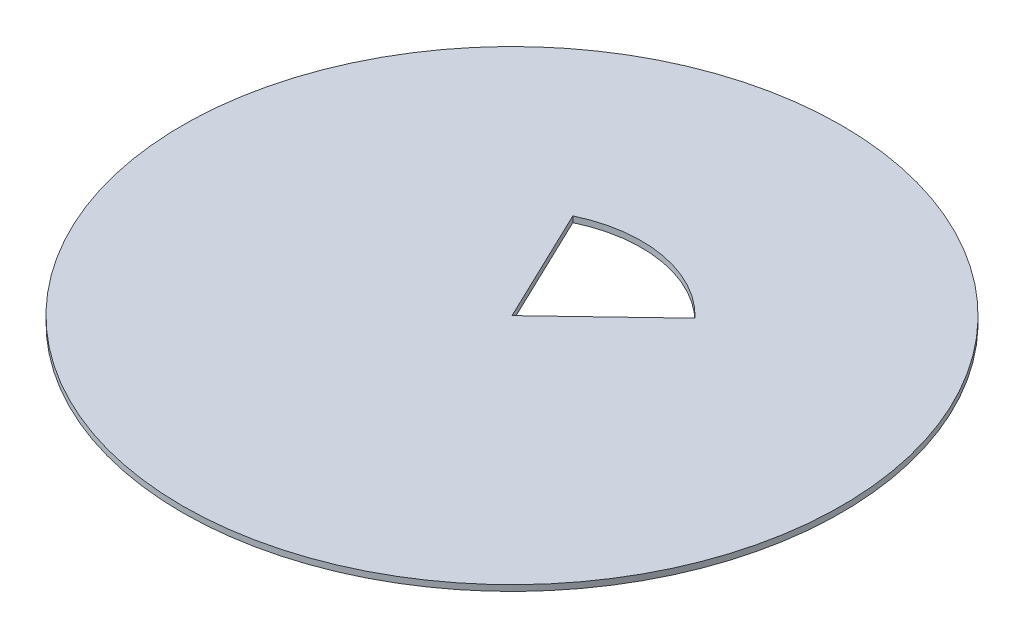
ISO-10303-21;
HEADER;
FILE_DESCRIPTION(('STEP AP214'),'2;1');
FILE_NAME('part.step','',(''),(''),'','','');
FILE_SCHEMA(('AUTOMOTIVE_DESIGN { 1 0 10303 214 1 1 1 1 }'));
ENDSEC;
DATA;
#1=APPLICATION_CONTEXT('core data for automotive mechanical design processes');
#2=APPLICATION_PROTOCOL_DEFINITION('international standard','automotive_design',2000,#1);
#3=PRODUCT_CONTEXT('',#1,'mechanical');
#4=PRODUCT('Part','Part','',(#3));
#5=PRODUCT_RELATED_PRODUCT_CATEGORY('part','',(#4));
#6=PRODUCT_DEFINITION_FORMATION('','',#4);
#7=PRODUCT_DEFINITION_CONTEXT('part definition',#1,'design');
#8=PRODUCT_DEFINITION('design','',#6,#7);
#9=PRODUCT_DEFINITION_SHAPE('','',#8);
#10=(LENGTH_UNIT() NAMED_UNIT(*) SI_UNIT(.MILLI.,.METRE.));
#11=(NAMED_UNIT(*) PLANE_ANGLE_UNIT() SI_UNIT($,.RADIAN.));
#12=(NAMED_UNIT(*) SI_UNIT($,.STERADIAN.) SOLID_ANGLE_UNIT());
#13=UNCERTAINTY_MEASURE_WITH_UNIT(LENGTH_MEASURE(1.E-05),#10,'distance_accuracy_value','');
#14=(GEOMETRIC_REPRESENTATION_CONTEXT(3) GLOBAL_UNCERTAINTY_ASSIGNED_CONTEXT((#13)) GLOBAL_UNIT_ASSIGNED_CONTEXT((#10,
#11,#12)) REPRESENTATION_CONTEXT('',''));
#15=CARTESIAN_POINT('',(0.,0.,0.));
#16=DIRECTION('',(0.,0.,1.));
#17=DIRECTION('',(1.,0.,0.));
#18=AXIS2_PLACEMENT_3D('',#15,#16,#17);
#19=CARTESIAN_POINT('',(0.,3.175,0.));
#20=DIRECTION('',(0.,-1.,0.));
#21=DIRECTION('',(0.,0.,-1.));
#22=AXIS2_PLACEMENT_3D('',#19,#20,#21);
#23=CYLINDRICAL_SURFACE('',#22,177.8);
#24=CARTESIAN_POINT('',(0.,3.175,0.));
#25=DIRECTION('',(0.,1.,0.));
#26=DIRECTION('',(0.,0.,1.));
#27=AXIS2_PLACEMENT_3D('',#24,#25,#26);
#28=CIRCLE('',#27,177.8);
#29=CARTESIAN_POINT('',(0.,3.175,177.8));
#30=VERTEX_POINT('',#29);
#31=EDGE_CURVE('E11',#30,#30,#28,.T.);
#32=ORIENTED_EDGE('',*,*,#31,.F.);
#33=EDGE_LOOP('',(#32));
#34=FACE_BOUND('',#33,.T.);
#35=CARTESIAN_POINT('',(0.,0.,0.));
#36=DIRECTION('',(0.,1.,0.));
#37=DIRECTION('',(0.,0.,1.));
#38=AXIS2_PLACEMENT_3D('',#35,#36,#37);
#39=CIRCLE('',#38,177.8);
#40=CARTESIAN_POINT('',(0.,0.,177.8));
#41=VERTEX_POINT('',#40);
#42=EDGE_CURVE('E37',#41,#41,#39,.T.);
#43=ORIENTED_EDGE('',*,*,#42,.T.);
#44=EDGE_LOOP('',(#43));
#45=FACE_BOUND('',#44,.T.);
#46=ADVANCED_FACE('F34',(#34,#45),#23,.T.);
#47=CARTESIAN_POINT('',(0.,3.175,0.));
#48=DIRECTION('',(0.,1.,0.));
#49=DIRECTION('',(0.,0.,1.));
#50=AXIS2_PLACEMENT_3D('',#47,#48,#49);
#51=PLANE('',#50);
#52=CARTESIAN_POINT('',(0.,3.175,0.));
#53=DIRECTION('',(0.,1.,0.));
#54=DIRECTION('',(0.,0.,-1.));
#55=AXIS2_PLACEMENT_3D('',#52,#53,#54);
#56=CIRCLE('',#55,69.85);
#57=CARTESIAN_POINT('',(50.5907209700384,3.175,-48.1622409334503));
#58=VERTEX_POINT('',#57);
#59=CARTESIAN_POINT('',(-30.1716205417122,3.175,-62.9975857782418));
#60=VERTEX_POINT('',#59);
#61=EDGE_CURVE('E48',#58,#60,#56,.T.);
#62=ORIENTED_EDGE('',*,*,#61,.F.);
#63=DIRECTION('',(0.72427660658609,0.,-0.6895095337645));
#64=VECTOR('',#63,1.);
#65=CARTESIAN_POINT('',(0.,3.175,0.));
#66=LINE('',#65,#64);
#67=CARTESIAN_POINT('',(0.,3.175,0.));
#68=VERTEX_POINT('',#67);
#69=EDGE_CURVE('E75',#68,#58,#66,.T.);
#70=ORIENTED_EDGE('',*,*,#69,.F.);
#71=DIRECTION('',(0.431948755071041,0.,0.901898150010619));
#72=VECTOR('',#71,1.);
#73=CARTESIAN_POINT('',(-30.1716205417122,3.175,-62.9975857782418));
#74=LINE('',#73,#72);
#75=EDGE_CURVE('E86',#60,#68,#74,.T.);
#76=ORIENTED_EDGE('',*,*,#75,.F.);
#77=EDGE_LOOP('',(#62,#70,#76));
#78=FACE_BOUND('',#77,.T.);
#79=ORIENTED_EDGE('',*,*,#31,.T.);
#80=EDGE_LOOP('',(#79));
#81=FACE_BOUND('',#80,.T.);
#82=ADVANCED_FACE('F97',(#78,#81),#51,.T.);
#83=CARTESIAN_POINT('',(0.,0.,0.));
#84=DIRECTION('',(0.,1.,0.));
#85=DIRECTION('',(0.,0.,1.));
#86=AXIS2_PLACEMENT_3D('',#83,#84,#85);
#87=PLANE('',#86);
#88=DIRECTION('',(-0.72427660658609,0.,0.6895095337645));
#89=VECTOR('',#88,1.);
#90=CARTESIAN_POINT('',(0.,0.,0.));
#91=LINE('',#90,#89);
#92=CARTESIAN_POINT('',(50.5907209700384,0.,-48.1622409334503));
#93=VERTEX_POINT('',#92);
#94=CARTESIAN_POINT('',(0.,0.,0.));
#95=VERTEX_POINT('',#94);
#96=EDGE_CURVE('E56',#93,#95,#91,.T.);
#97=ORIENTED_EDGE('',*,*,#96,.F.);
#98=CARTESIAN_POINT('',(0.,0.,0.));
#99=DIRECTION('',(0.,1.,0.));
#100=DIRECTION('',(0.,0.,1.));
#101=AXIS2_PLACEMENT_3D('',#98,#99,#100);
#102=CIRCLE('',#101,69.85);
#103=CARTESIAN_POINT('',(-30.1716205417122,0.,-62.9975857782418));
#104=VERTEX_POINT('',#103);
#105=EDGE_CURVE('E70',#104,#93,#102,.F.);
#106=ORIENTED_EDGE('',*,*,#105,.F.);
#107=DIRECTION('',(-0.431948755071041,0.,-0.901898150010619));
#108=VECTOR('',#107,1.);
#109=CARTESIAN_POINT('',(-30.1716205417122,0.,-62.9975857782418));
#110=LINE('',#109,#108);
#111=EDGE_CURVE('E78',#95,#104,#110,.T.);
#112=ORIENTED_EDGE('',*,*,#111,.F.);
#113=EDGE_LOOP('',(#97,#106,#112));
#114=FACE_BOUND('',#113,.T.);
#115=ORIENTED_EDGE('',*,*,#42,.F.);
#116=EDGE_LOOP('',(#115));
#117=FACE_BOUND('',#116,.T.);
#118=ADVANCED_FACE('F83',(#114,#117),#87,.F.);
#119=CARTESIAN_POINT('',(0.,-0.00100000000000013,0.));
#120=DIRECTION('',(0.,1.,0.));
#121=DIRECTION('',(0.,0.,1.));
#122=AXIS2_PLACEMENT_3D('',#119,#120,#121);
#123=CYLINDRICAL_SURFACE('',#122,69.85);
#124=ORIENTED_EDGE('',*,*,#105,.T.);
#125=DIRECTION('',(0.,1.,0.));
#126=VECTOR('',#125,1.);
#127=CARTESIAN_POINT('',(50.5907209700384,-0.00100000000000013,-48.1622409334503));
#128=LINE('',#127,#126);
#129=EDGE_CURVE('E81',#93,#58,#128,.T.);
#130=ORIENTED_EDGE('',*,*,#129,.T.);
#131=ORIENTED_EDGE('',*,*,#61,.T.);
#132=DIRECTION('',(0.,1.,0.));
#133=VECTOR('',#132,1.);
#134=CARTESIAN_POINT('',(-30.1716205417122,-0.00100000000000013,-62.9975857782418));
#135=LINE('',#134,#133);
#136=EDGE_CURVE('E66',#104,#60,#135,.T.);
#137=ORIENTED_EDGE('',*,*,#136,.F.);
#138=EDGE_LOOP('',(#124,#130,#131,#137));
#139=FACE_BOUND('',#138,.T.);
#140=ADVANCED_FACE('F68',(#139),#123,.F.);
#141=CARTESIAN_POINT('',(0.,-0.00100000000000013,0.));
#142=DIRECTION('',(0.6895095337645,0.,0.72427660658609));
#143=DIRECTION('',(0.72427660658609,0.,-0.6895095337645));
#144=AXIS2_PLACEMENT_3D('',#141,#142,#143);
#145=PLANE('',#144);
#146=ORIENTED_EDGE('',*,*,#96,.T.);
#147=DIRECTION('',(0.,1.,0.));
#148=VECTOR('',#147,1.);
#149=CARTESIAN_POINT('',(0.,-0.00100000000000013,0.));
#150=LINE('',#149,#148);
#151=EDGE_CURVE('E74',#95,#68,#150,.T.);
#152=ORIENTED_EDGE('',*,*,#151,.T.);
#153=ORIENTED_EDGE('',*,*,#69,.T.);
#154=ORIENTED_EDGE('',*,*,#129,.F.);
#155=EDGE_LOOP('',(#146,#152,#153,#154));
#156=FACE_BOUND('',#155,.T.);
#157=ADVANCED_FACE('F94',(#156),#145,.F.);
#158=CARTESIAN_POINT('',(-30.1716205417122,-0.00100000000000013,-62.9975857782418));
#159=DIRECTION('',(-0.901898150010619,0.,0.431948755071041));
#160=DIRECTION('',(0.431948755071041,0.,0.901898150010619));
#161=AXIS2_PLACEMENT_3D('',#158,#159,#160);
#162=PLANE('',#161);
#163=ORIENTED_EDGE('',*,*,#111,.T.);
#164=ORIENTED_EDGE('',*,*,#136,.T.);
#165=ORIENTED_EDGE('',*,*,#75,.T.);
#166=ORIENTED_EDGE('',*,*,#151,.F.);
#167=EDGE_LOOP('',(#163,#164,#165,#166));
#168=FACE_BOUND('',#167,.T.);
#169=ADVANCED_FACE('F79',(#168),#162,.F.);
#170=CLOSED_SHELL('',(#46,#82,#118,#140,#157,#169));
#171=MANIFOLD_SOLID_BREP('B2',#170);
#172=ADVANCED_BREP_SHAPE_REPRESENTATION('',(#18,#171),#14);
#173=SHAPE_DEFINITION_REPRESENTATION(#9,#172);
ENDSEC;
END-ISO-10303-21;
